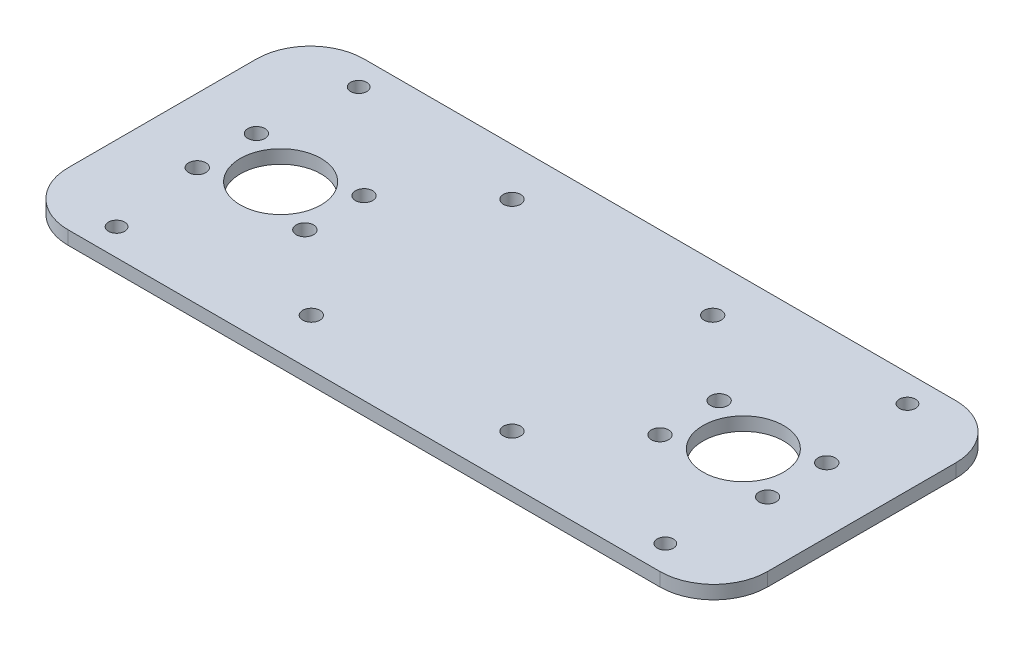
ISO-10303-21;
HEADER;
FILE_DESCRIPTION(('STEP AP214'),'2;1');
FILE_NAME('part.step','',(''),(''),'','','');
FILE_SCHEMA(('AUTOMOTIVE_DESIGN { 1 0 10303 214 1 1 1 1 }'));
ENDSEC;
DATA;
#1=APPLICATION_CONTEXT('core data for automotive mechanical design processes');
#2=APPLICATION_PROTOCOL_DEFINITION('international standard','automotive_design',2000,#1);
#3=PRODUCT_CONTEXT('',#1,'mechanical');
#4=PRODUCT('Part','Part','',(#3));
#5=PRODUCT_RELATED_PRODUCT_CATEGORY('part','',(#4));
#6=PRODUCT_DEFINITION_FORMATION('','',#4);
#7=PRODUCT_DEFINITION_CONTEXT('part definition',#1,'design');
#8=PRODUCT_DEFINITION('design','',#6,#7);
#9=PRODUCT_DEFINITION_SHAPE('','',#8);
#10=(LENGTH_UNIT() NAMED_UNIT(*) SI_UNIT(.MILLI.,.METRE.));
#11=(NAMED_UNIT(*) PLANE_ANGLE_UNIT() SI_UNIT($,.RADIAN.));
#12=(NAMED_UNIT(*) SI_UNIT($,.STERADIAN.) SOLID_ANGLE_UNIT());
#13=UNCERTAINTY_MEASURE_WITH_UNIT(LENGTH_MEASURE(1.E-05),#10,'distance_accuracy_value','');
#14=(GEOMETRIC_REPRESENTATION_CONTEXT(3) GLOBAL_UNCERTAINTY_ASSIGNED_CONTEXT((#13)) GLOBAL_UNIT_ASSIGNED_CONTEXT((#10,
#11,#12)) REPRESENTATION_CONTEXT('',''));
#15=CARTESIAN_POINT('',(0.,0.,0.));
#16=DIRECTION('',(0.,0.,1.));
#17=DIRECTION('',(1.,0.,0.));
#18=AXIS2_PLACEMENT_3D('',#15,#16,#17);
#19=CARTESIAN_POINT('',(10.,2.5,-45.));
#20=DIRECTION('',(0.,-1.,0.));
#21=DIRECTION('',(0.,0.,-1.));
#22=AXIS2_PLACEMENT_3D('',#19,#20,#21);
#23=CYLINDRICAL_SURFACE('',#22,10.);
#24=CARTESIAN_POINT('',(10.,0.,-45.));
#25=DIRECTION('',(0.,1.,0.));
#26=DIRECTION('',(0.,0.,1.));
#27=AXIS2_PLACEMENT_3D('',#24,#25,#26);
#28=CIRCLE('',#27,10.);
#29=CARTESIAN_POINT('',(10.0000000000001,0.,-55.));
#30=VERTEX_POINT('',#29);
#31=CARTESIAN_POINT('',(0.,0.,-44.9999999999999));
#32=VERTEX_POINT('',#31);
#33=EDGE_CURVE('E140',#30,#32,#28,.T.);
#34=ORIENTED_EDGE('',*,*,#33,.T.);
#35=DIRECTION('',(0.,-1.,0.));
#36=VECTOR('',#35,1.);
#37=CARTESIAN_POINT('',(0.,2.5,-44.9999999999999));
#38=LINE('',#37,#36);
#39=CARTESIAN_POINT('',(0.,2.5,-44.9999999999999));
#40=VERTEX_POINT('',#39);
#41=EDGE_CURVE('E11',#40,#32,#38,.T.);
#42=ORIENTED_EDGE('',*,*,#41,.F.);
#43=CARTESIAN_POINT('',(10.,2.5,-45.));
#44=DIRECTION('',(0.,1.,0.));
#45=DIRECTION('',(0.,0.,1.));
#46=AXIS2_PLACEMENT_3D('',#43,#44,#45);
#47=CIRCLE('',#46,10.);
#48=CARTESIAN_POINT('',(10.0000000000001,2.5,-55.));
#49=VERTEX_POINT('',#48);
#50=EDGE_CURVE('E155',#49,#40,#47,.T.);
#51=ORIENTED_EDGE('',*,*,#50,.F.);
#52=DIRECTION('',(0.,-1.,0.));
#53=VECTOR('',#52,1.);
#54=CARTESIAN_POINT('',(10.0000000000001,2.5,-55.));
#55=LINE('',#54,#53);
#56=EDGE_CURVE('E136',#49,#30,#55,.T.);
#57=ORIENTED_EDGE('',*,*,#56,.T.);
#58=EDGE_LOOP('',(#34,#42,#51,#57));
#59=FACE_BOUND('',#58,.T.);
#60=ADVANCED_FACE('F42',(#59),#23,.T.);
#61=CARTESIAN_POINT('',(0.,2.5,-10.0000000000001));
#62=DIRECTION('',(1.,0.,0.));
#63=DIRECTION('',(0.,0.,-1.));
#64=AXIS2_PLACEMENT_3D('',#61,#62,#63);
#65=PLANE('',#64);
#66=DIRECTION('',(0.,0.,1.));
#67=VECTOR('',#66,1.);
#68=CARTESIAN_POINT('',(0.,0.,-10.0000000000001));
#69=LINE('',#68,#67);
#70=CARTESIAN_POINT('',(0.,0.,-10.0000000000001));
#71=VERTEX_POINT('',#70);
#72=EDGE_CURVE('E143',#32,#71,#69,.T.);
#73=ORIENTED_EDGE('',*,*,#72,.T.);
#74=DIRECTION('',(0.,-1.,0.));
#75=VECTOR('',#74,1.);
#76=CARTESIAN_POINT('',(0.,2.5,-10.0000000000001));
#77=LINE('',#76,#75);
#78=CARTESIAN_POINT('',(0.,2.5,-10.0000000000001));
#79=VERTEX_POINT('',#78);
#80=EDGE_CURVE('E51',#79,#71,#77,.T.);
#81=ORIENTED_EDGE('',*,*,#80,.F.);
#82=DIRECTION('',(0.,0.,1.));
#83=VECTOR('',#82,1.);
#84=CARTESIAN_POINT('',(0.,2.5,-10.0000000000001));
#85=LINE('',#84,#83);
#86=EDGE_CURVE('E103',#40,#79,#85,.T.);
#87=ORIENTED_EDGE('',*,*,#86,.F.);
#88=ORIENTED_EDGE('',*,*,#41,.T.);
#89=EDGE_LOOP('',(#73,#81,#87,#88));
#90=FACE_BOUND('',#89,.T.);
#91=ADVANCED_FACE('F291',(#90),#65,.F.);
#92=CARTESIAN_POINT('',(10.,2.5,-10.));
#93=DIRECTION('',(0.,-1.,0.));
#94=DIRECTION('',(0.,0.,-1.));
#95=AXIS2_PLACEMENT_3D('',#92,#93,#94);
#96=CYLINDRICAL_SURFACE('',#95,10.);
#97=CARTESIAN_POINT('',(10.,0.,-10.));
#98=DIRECTION('',(0.,1.,0.));
#99=DIRECTION('',(0.,0.,1.));
#100=AXIS2_PLACEMENT_3D('',#97,#98,#99);
#101=CIRCLE('',#100,10.);
#102=CARTESIAN_POINT('',(10.0000000000001,0.,0.));
#103=VERTEX_POINT('',#102);
#104=EDGE_CURVE('E146',#71,#103,#101,.T.);
#105=ORIENTED_EDGE('',*,*,#104,.T.);
#106=DIRECTION('',(0.,-1.,0.));
#107=VECTOR('',#106,1.);
#108=CARTESIAN_POINT('',(10.0000000000001,2.5,0.));
#109=LINE('',#108,#107);
#110=CARTESIAN_POINT('',(10.0000000000001,2.5,0.));
#111=VERTEX_POINT('',#110);
#112=EDGE_CURVE('E162',#111,#103,#109,.T.);
#113=ORIENTED_EDGE('',*,*,#112,.F.);
#114=CARTESIAN_POINT('',(10.,2.5,-10.));
#115=DIRECTION('',(0.,1.,0.));
#116=DIRECTION('',(0.,0.,1.));
#117=AXIS2_PLACEMENT_3D('',#114,#115,#116);
#118=CIRCLE('',#117,10.);
#119=EDGE_CURVE('E258',#79,#111,#118,.T.);
#120=ORIENTED_EDGE('',*,*,#119,.F.);
#121=ORIENTED_EDGE('',*,*,#80,.T.);
#122=EDGE_LOOP('',(#105,#113,#120,#121));
#123=FACE_BOUND('',#122,.T.);
#124=ADVANCED_FACE('F295',(#123),#96,.T.);
#125=CARTESIAN_POINT('',(10.0000000000001,2.5,0.));
#126=DIRECTION('',(0.,0.,-1.));
#127=DIRECTION('',(-1.,0.,0.));
#128=AXIS2_PLACEMENT_3D('',#125,#126,#127);
#129=PLANE('',#128);
#130=DIRECTION('',(1.,0.,0.));
#131=VECTOR('',#130,1.);
#132=CARTESIAN_POINT('',(10.0000000000001,0.,0.));
#133=LINE('',#132,#131);
#134=CARTESIAN_POINT('',(120.,0.,0.));
#135=VERTEX_POINT('',#134);
#136=EDGE_CURVE('E148',#103,#135,#133,.T.);
#137=ORIENTED_EDGE('',*,*,#136,.T.);
#138=DIRECTION('',(0.,-1.,0.));
#139=VECTOR('',#138,1.);
#140=CARTESIAN_POINT('',(120.,2.5,0.));
#141=LINE('',#140,#139);
#142=CARTESIAN_POINT('',(120.,2.5,0.));
#143=VERTEX_POINT('',#142);
#144=EDGE_CURVE('E159',#143,#135,#141,.T.);
#145=ORIENTED_EDGE('',*,*,#144,.F.);
#146=DIRECTION('',(1.,0.,0.));
#147=VECTOR('',#146,1.);
#148=CARTESIAN_POINT('',(10.0000000000001,2.5,0.));
#149=LINE('',#148,#147);
#150=EDGE_CURVE('E260',#111,#143,#149,.T.);
#151=ORIENTED_EDGE('',*,*,#150,.F.);
#152=ORIENTED_EDGE('',*,*,#112,.T.);
#153=EDGE_LOOP('',(#137,#145,#151,#152));
#154=FACE_BOUND('',#153,.T.);
#155=ADVANCED_FACE('F266',(#154),#129,.F.);
#156=CARTESIAN_POINT('',(120.,2.5,-10.));
#157=DIRECTION('',(0.,-1.,0.));
#158=DIRECTION('',(0.,0.,-1.));
#159=AXIS2_PLACEMENT_3D('',#156,#157,#158);
#160=CYLINDRICAL_SURFACE('',#159,10.);
#161=CARTESIAN_POINT('',(120.,0.,-10.));
#162=DIRECTION('',(0.,1.,0.));
#163=DIRECTION('',(0.,0.,-1.));
#164=AXIS2_PLACEMENT_3D('',#161,#162,#163);
#165=CIRCLE('',#164,10.);
#166=CARTESIAN_POINT('',(130.,0.,-10.0000000000001));
#167=VERTEX_POINT('',#166);
#168=EDGE_CURVE('E150',#135,#167,#165,.T.);
#169=ORIENTED_EDGE('',*,*,#168,.T.);
#170=DIRECTION('',(0.,-1.,0.));
#171=VECTOR('',#170,1.);
#172=CARTESIAN_POINT('',(130.,2.5,-10.0000000000001));
#173=LINE('',#172,#171);
#174=CARTESIAN_POINT('',(130.,2.5,-10.0000000000001));
#175=VERTEX_POINT('',#174);
#176=EDGE_CURVE('E131',#175,#167,#173,.T.);
#177=ORIENTED_EDGE('',*,*,#176,.F.);
#178=CARTESIAN_POINT('',(120.,2.5,-10.));
#179=DIRECTION('',(0.,1.,0.));
#180=DIRECTION('',(0.,0.,-1.));
#181=AXIS2_PLACEMENT_3D('',#178,#179,#180);
#182=CIRCLE('',#181,10.);
#183=EDGE_CURVE('E122',#143,#175,#182,.T.);
#184=ORIENTED_EDGE('',*,*,#183,.F.);
#185=ORIENTED_EDGE('',*,*,#144,.T.);
#186=EDGE_LOOP('',(#169,#177,#184,#185));
#187=FACE_BOUND('',#186,.T.);
#188=ADVANCED_FACE('F270',(#187),#160,.T.);
#189=CARTESIAN_POINT('',(130.,2.5,-10.0000000000001));
#190=DIRECTION('',(-1.,0.,0.));
#191=DIRECTION('',(0.,0.,1.));
#192=AXIS2_PLACEMENT_3D('',#189,#190,#191);
#193=PLANE('',#192);
#194=DIRECTION('',(0.,0.,-1.));
#195=VECTOR('',#194,1.);
#196=CARTESIAN_POINT('',(130.,0.,-10.0000000000001));
#197=LINE('',#196,#195);
#198=CARTESIAN_POINT('',(130.,0.,-44.9999999999999));
#199=VERTEX_POINT('',#198);
#200=EDGE_CURVE('E130',#167,#199,#197,.T.);
#201=ORIENTED_EDGE('',*,*,#200,.T.);
#202=DIRECTION('',(0.,-1.,0.));
#203=VECTOR('',#202,1.);
#204=CARTESIAN_POINT('',(130.,2.5,-44.9999999999999));
#205=LINE('',#204,#203);
#206=CARTESIAN_POINT('',(130.,2.5,-44.9999999999999));
#207=VERTEX_POINT('',#206);
#208=EDGE_CURVE('E127',#207,#199,#205,.T.);
#209=ORIENTED_EDGE('',*,*,#208,.F.);
#210=DIRECTION('',(0.,0.,-1.));
#211=VECTOR('',#210,1.);
#212=CARTESIAN_POINT('',(130.,2.5,-10.0000000000001));
#213=LINE('',#212,#211);
#214=EDGE_CURVE('E116',#175,#207,#213,.T.);
#215=ORIENTED_EDGE('',*,*,#214,.F.);
#216=ORIENTED_EDGE('',*,*,#176,.T.);
#217=EDGE_LOOP('',(#201,#209,#215,#216));
#218=FACE_BOUND('',#217,.T.);
#219=ADVANCED_FACE('F128',(#218),#193,.F.);
#220=CARTESIAN_POINT('',(120.,2.5,-45.));
#221=DIRECTION('',(0.,-1.,0.));
#222=DIRECTION('',(0.,0.,-1.));
#223=AXIS2_PLACEMENT_3D('',#220,#221,#222);
#224=CYLINDRICAL_SURFACE('',#223,10.);
#225=CARTESIAN_POINT('',(120.,0.,-45.));
#226=DIRECTION('',(0.,1.,0.));
#227=DIRECTION('',(0.,0.,-1.));
#228=AXIS2_PLACEMENT_3D('',#225,#226,#227);
#229=CIRCLE('',#228,10.);
#230=CARTESIAN_POINT('',(120.,0.,-55.));
#231=VERTEX_POINT('',#230);
#232=EDGE_CURVE('E89',#199,#231,#229,.T.);
#233=ORIENTED_EDGE('',*,*,#232,.T.);
#234=DIRECTION('',(0.,-1.,0.));
#235=VECTOR('',#234,1.);
#236=CARTESIAN_POINT('',(120.,2.5,-55.));
#237=LINE('',#236,#235);
#238=CARTESIAN_POINT('',(120.,2.5,-55.));
#239=VERTEX_POINT('',#238);
#240=EDGE_CURVE('E132',#239,#231,#237,.T.);
#241=ORIENTED_EDGE('',*,*,#240,.F.);
#242=CARTESIAN_POINT('',(120.,2.5,-45.));
#243=DIRECTION('',(0.,1.,0.));
#244=DIRECTION('',(0.,0.,-1.));
#245=AXIS2_PLACEMENT_3D('',#242,#243,#244);
#246=CIRCLE('',#245,10.);
#247=EDGE_CURVE('E120',#207,#239,#246,.T.);
#248=ORIENTED_EDGE('',*,*,#247,.F.);
#249=ORIENTED_EDGE('',*,*,#208,.T.);
#250=EDGE_LOOP('',(#233,#241,#248,#249));
#251=FACE_BOUND('',#250,.T.);
#252=ADVANCED_FACE('F134',(#251),#224,.T.);
#253=CARTESIAN_POINT('',(10.0000000000001,2.5,-55.));
#254=DIRECTION('',(0.,0.,1.));
#255=DIRECTION('',(1.,0.,0.));
#256=AXIS2_PLACEMENT_3D('',#253,#254,#255);
#257=PLANE('',#256);
#258=DIRECTION('',(-1.,0.,0.));
#259=VECTOR('',#258,1.);
#260=CARTESIAN_POINT('',(10.0000000000001,0.,-55.));
#261=LINE('',#260,#259);
#262=EDGE_CURVE('E95',#231,#30,#261,.T.);
#263=ORIENTED_EDGE('',*,*,#262,.T.);
#264=ORIENTED_EDGE('',*,*,#56,.F.);
#265=DIRECTION('',(-1.,0.,0.));
#266=VECTOR('',#265,1.);
#267=CARTESIAN_POINT('',(10.0000000000001,2.5,-55.));
#268=LINE('',#267,#266);
#269=EDGE_CURVE('E60',#239,#49,#268,.T.);
#270=ORIENTED_EDGE('',*,*,#269,.F.);
#271=ORIENTED_EDGE('',*,*,#240,.T.);
#272=EDGE_LOOP('',(#263,#264,#270,#271));
#273=FACE_BOUND('',#272,.T.);
#274=ADVANCED_FACE('F278',(#273),#257,.F.);
#275=CARTESIAN_POINT('',(10.,2.5,-45.));
#276=DIRECTION('',(0.,1.,0.));
#277=DIRECTION('',(0.,0.,1.));
#278=AXIS2_PLACEMENT_3D('',#275,#276,#277);
#279=PLANE('',#278);
#280=CARTESIAN_POINT('',(22.,2.5,-27.5));
#281=DIRECTION('',(0.,1.,0.));
#282=DIRECTION('',(0.,0.,1.));
#283=AXIS2_PLACEMENT_3D('',#280,#281,#282);
#284=CIRCLE('',#283,7.5);
#285=CARTESIAN_POINT('',(22.,2.5,-20.));
#286=VERTEX_POINT('',#285);
#287=EDGE_CURVE('E514',#286,#286,#284,.T.);
#288=ORIENTED_EDGE('',*,*,#287,.F.);
#289=EDGE_LOOP('',(#288));
#290=FACE_BOUND('',#289,.T.);
#291=CARTESIAN_POINT('',(108.,2.5,-27.5));
#292=DIRECTION('',(0.,1.,0.));
#293=DIRECTION('',(0.,0.,1.));
#294=AXIS2_PLACEMENT_3D('',#291,#292,#293);
#295=CIRCLE('',#294,7.50000000000001);
#296=CARTESIAN_POINT('',(108.,2.5,-20.));
#297=VERTEX_POINT('',#296);
#298=EDGE_CURVE('E518',#297,#297,#295,.T.);
#299=ORIENTED_EDGE('',*,*,#298,.F.);
#300=EDGE_LOOP('',(#299));
#301=FACE_BOUND('',#300,.T.);
#302=CARTESIAN_POINT('',(46.35,2.5,-8.85000000000002));
#303=DIRECTION('',(0.,1.,0.));
#304=DIRECTION('',(0.,0.,-1.));
#305=AXIS2_PLACEMENT_3D('',#302,#303,#304);
#306=CIRCLE('',#305,1.6);
#307=CARTESIAN_POINT('',(46.35,2.5,-10.45));
#308=VERTEX_POINT('',#307);
#309=EDGE_CURVE('E527',#308,#308,#306,.T.);
#310=ORIENTED_EDGE('',*,*,#309,.F.);
#311=EDGE_LOOP('',(#310));
#312=FACE_BOUND('',#311,.T.);
#313=CARTESIAN_POINT('',(83.6499999999999,2.5,-8.84999999999998));
#314=DIRECTION('',(0.,1.,0.));
#315=DIRECTION('',(0.,0.,1.));
#316=AXIS2_PLACEMENT_3D('',#313,#314,#315);
#317=CIRCLE('',#316,1.59999999999999);
#318=CARTESIAN_POINT('',(83.6499999999999,2.5,-7.24999999999999));
#319=VERTEX_POINT('',#318);
#320=EDGE_CURVE('E531',#319,#319,#317,.T.);
#321=ORIENTED_EDGE('',*,*,#320,.F.);
#322=EDGE_LOOP('',(#321));
#323=FACE_BOUND('',#322,.T.);
#324=CARTESIAN_POINT('',(83.65,2.5,-46.15));
#325=DIRECTION('',(0.,1.,0.));
#326=DIRECTION('',(0.,0.,-1.));
#327=AXIS2_PLACEMENT_3D('',#324,#325,#326);
#328=CIRCLE('',#327,1.59999999999999);
#329=CARTESIAN_POINT('',(83.65,2.5,-47.75));
#330=VERTEX_POINT('',#329);
#331=EDGE_CURVE('E528',#330,#330,#328,.T.);
#332=ORIENTED_EDGE('',*,*,#331,.F.);
#333=EDGE_LOOP('',(#332));
#334=FACE_BOUND('',#333,.T.);
#335=CARTESIAN_POINT('',(46.35,2.5,-46.15));
#336=DIRECTION('',(0.,1.,0.));
#337=DIRECTION('',(0.,0.,1.));
#338=AXIS2_PLACEMENT_3D('',#335,#336,#337);
#339=CIRCLE('',#338,1.6);
#340=CARTESIAN_POINT('',(46.35,2.5,-44.55));
#341=VERTEX_POINT('',#340);
#342=EDGE_CURVE('E201',#341,#341,#339,.T.);
#343=ORIENTED_EDGE('',*,*,#342,.F.);
#344=EDGE_LOOP('',(#343));
#345=FACE_BOUND('',#344,.T.);
#346=CARTESIAN_POINT('',(98.,2.5,-22.));
#347=DIRECTION('',(0.,1.,0.));
#348=DIRECTION('',(0.,0.,1.));
#349=AXIS2_PLACEMENT_3D('',#346,#347,#348);
#350=CIRCLE('',#349,1.6);
#351=CARTESIAN_POINT('',(98.,2.5,-20.4));
#352=VERTEX_POINT('',#351);
#353=EDGE_CURVE('E217',#352,#352,#350,.T.);
#354=ORIENTED_EDGE('',*,*,#353,.F.);
#355=EDGE_LOOP('',(#354));
#356=FACE_BOUND('',#355,.T.);
#357=CARTESIAN_POINT('',(118.,2.5,-33.));
#358=DIRECTION('',(0.,1.,0.));
#359=DIRECTION('',(0.,0.,1.));
#360=AXIS2_PLACEMENT_3D('',#357,#358,#359);
#361=CIRCLE('',#360,1.60000000000001);
#362=CARTESIAN_POINT('',(118.,2.5,-31.4));
#363=VERTEX_POINT('',#362);
#364=EDGE_CURVE('E212',#363,#363,#361,.T.);
#365=ORIENTED_EDGE('',*,*,#364,.F.);
#366=EDGE_LOOP('',(#365));
#367=FACE_BOUND('',#366,.T.);
#368=CARTESIAN_POINT('',(118.,2.5,-22.));
#369=DIRECTION('',(0.,1.,0.));
#370=DIRECTION('',(0.,0.,1.));
#371=AXIS2_PLACEMENT_3D('',#368,#369,#370);
#372=CIRCLE('',#371,1.6);
#373=CARTESIAN_POINT('',(118.,2.5,-20.4));
#374=VERTEX_POINT('',#373);
#375=EDGE_CURVE('E208',#374,#374,#372,.T.);
#376=ORIENTED_EDGE('',*,*,#375,.F.);
#377=EDGE_LOOP('',(#376));
#378=FACE_BOUND('',#377,.T.);
#379=CARTESIAN_POINT('',(98.,2.5,-33.));
#380=DIRECTION('',(0.,1.,0.));
#381=DIRECTION('',(0.,0.,1.));
#382=AXIS2_PLACEMENT_3D('',#379,#380,#381);
#383=CIRCLE('',#382,1.60000000000001);
#384=CARTESIAN_POINT('',(98.,2.5,-31.4));
#385=VERTEX_POINT('',#384);
#386=EDGE_CURVE('E187',#385,#385,#383,.T.);
#387=ORIENTED_EDGE('',*,*,#386,.F.);
#388=EDGE_LOOP('',(#387));
#389=FACE_BOUND('',#388,.T.);
#390=CARTESIAN_POINT('',(32.,2.5,-33.));
#391=DIRECTION('',(0.,1.,0.));
#392=DIRECTION('',(0.,0.,1.));
#393=AXIS2_PLACEMENT_3D('',#390,#391,#392);
#394=CIRCLE('',#393,1.6);
#395=CARTESIAN_POINT('',(32.,2.5,-31.4));
#396=VERTEX_POINT('',#395);
#397=EDGE_CURVE('E180',#396,#396,#394,.T.);
#398=ORIENTED_EDGE('',*,*,#397,.F.);
#399=EDGE_LOOP('',(#398));
#400=FACE_BOUND('',#399,.T.);
#401=CARTESIAN_POINT('',(32.,2.5,-22.));
#402=DIRECTION('',(0.,1.,0.));
#403=DIRECTION('',(0.,0.,1.));
#404=AXIS2_PLACEMENT_3D('',#401,#402,#403);
#405=CIRCLE('',#404,1.6);
#406=CARTESIAN_POINT('',(32.,2.5,-20.4));
#407=VERTEX_POINT('',#406);
#408=EDGE_CURVE('E196',#407,#407,#405,.T.);
#409=ORIENTED_EDGE('',*,*,#408,.F.);
#410=EDGE_LOOP('',(#409));
#411=FACE_BOUND('',#410,.T.);
#412=CARTESIAN_POINT('',(12.,2.5,-22.));
#413=DIRECTION('',(0.,1.,0.));
#414=DIRECTION('',(0.,0.,1.));
#415=AXIS2_PLACEMENT_3D('',#412,#413,#414);
#416=CIRCLE('',#415,1.6);
#417=CARTESIAN_POINT('',(12.,2.5,-20.4));
#418=VERTEX_POINT('',#417);
#419=EDGE_CURVE('E175',#418,#418,#416,.T.);
#420=ORIENTED_EDGE('',*,*,#419,.F.);
#421=EDGE_LOOP('',(#420));
#422=FACE_BOUND('',#421,.T.);
#423=CARTESIAN_POINT('',(12.,2.5,-33.));
#424=DIRECTION('',(0.,1.,0.));
#425=DIRECTION('',(0.,0.,1.));
#426=AXIS2_PLACEMENT_3D('',#423,#424,#425);
#427=CIRCLE('',#426,1.6);
#428=CARTESIAN_POINT('',(12.,2.5,-31.4));
#429=VERTEX_POINT('',#428);
#430=EDGE_CURVE('E171',#429,#429,#427,.T.);
#431=ORIENTED_EDGE('',*,*,#430,.F.);
#432=EDGE_LOOP('',(#431));
#433=FACE_BOUND('',#432,.T.);
#434=CARTESIAN_POINT('',(116.,2.5,-50.));
#435=DIRECTION('',(0.,1.,0.));
#436=DIRECTION('',(0.,0.,-1.));
#437=AXIS2_PLACEMENT_3D('',#434,#435,#436);
#438=CIRCLE('',#437,1.5);
#439=CARTESIAN_POINT('',(116.,2.5,-51.5));
#440=VERTEX_POINT('',#439);
#441=EDGE_CURVE('E170',#440,#440,#438,.T.);
#442=ORIENTED_EDGE('',*,*,#441,.F.);
#443=EDGE_LOOP('',(#442));
#444=FACE_BOUND('',#443,.T.);
#445=CARTESIAN_POINT('',(116.,2.5,-4.99999999999997));
#446=DIRECTION('',(0.,1.,0.));
#447=DIRECTION('',(0.,0.,-1.));
#448=AXIS2_PLACEMENT_3D('',#445,#446,#447);
#449=CIRCLE('',#448,1.5);
#450=CARTESIAN_POINT('',(116.,2.5,-6.49999999999997));
#451=VERTEX_POINT('',#450);
#452=EDGE_CURVE('E237',#451,#451,#449,.T.);
#453=ORIENTED_EDGE('',*,*,#452,.F.);
#454=EDGE_LOOP('',(#453));
#455=FACE_BOUND('',#454,.T.);
#456=CARTESIAN_POINT('',(14.,2.5,-50.));
#457=DIRECTION('',(0.,1.,0.));
#458=DIRECTION('',(0.,0.,1.));
#459=AXIS2_PLACEMENT_3D('',#456,#457,#458);
#460=CIRCLE('',#459,1.5);
#461=CARTESIAN_POINT('',(14.,2.5,-48.5));
#462=VERTEX_POINT('',#461);
#463=EDGE_CURVE('E243',#462,#462,#460,.T.);
#464=ORIENTED_EDGE('',*,*,#463,.F.);
#465=EDGE_LOOP('',(#464));
#466=FACE_BOUND('',#465,.T.);
#467=CARTESIAN_POINT('',(14.,2.5,-5.));
#468=DIRECTION('',(0.,1.,0.));
#469=DIRECTION('',(0.,0.,1.));
#470=AXIS2_PLACEMENT_3D('',#467,#468,#469);
#471=CIRCLE('',#470,1.5);
#472=CARTESIAN_POINT('',(14.,2.5,-3.5));
#473=VERTEX_POINT('',#472);
#474=EDGE_CURVE('E249',#473,#473,#471,.T.);
#475=ORIENTED_EDGE('',*,*,#474,.F.);
#476=EDGE_LOOP('',(#475));
#477=FACE_BOUND('',#476,.T.);
#478=ORIENTED_EDGE('',*,*,#50,.T.);
#479=ORIENTED_EDGE('',*,*,#86,.T.);
#480=ORIENTED_EDGE('',*,*,#119,.T.);
#481=ORIENTED_EDGE('',*,*,#150,.T.);
#482=ORIENTED_EDGE('',*,*,#183,.T.);
#483=ORIENTED_EDGE('',*,*,#214,.T.);
#484=ORIENTED_EDGE('',*,*,#247,.T.);
#485=ORIENTED_EDGE('',*,*,#269,.T.);
#486=EDGE_LOOP('',(#478,#479,#480,#481,#482,#483,#484,#485));
#487=FACE_BOUND('',#486,.T.);
#488=ADVANCED_FACE('F118',(#290,#301,#312,#323,#334,#345,#356,#367,#378,#389,#400,#411,#422,
#433,#444,#455,#466,#477,#487),#279,.T.);
#489=CARTESIAN_POINT('',(10.,0.,-45.));
#490=DIRECTION('',(0.,1.,0.));
#491=DIRECTION('',(0.,0.,1.));
#492=AXIS2_PLACEMENT_3D('',#489,#490,#491);
#493=PLANE('',#492);
#494=CARTESIAN_POINT('',(22.,0.,-27.5));
#495=DIRECTION('',(0.,-1.,0.));
#496=DIRECTION('',(0.,0.,-1.));
#497=AXIS2_PLACEMENT_3D('',#494,#495,#496);
#498=CIRCLE('',#497,7.5);
#499=CARTESIAN_POINT('',(22.,0.,-35.));
#500=VERTEX_POINT('',#499);
#501=EDGE_CURVE('E517',#500,#500,#498,.T.);
#502=ORIENTED_EDGE('',*,*,#501,.F.);
#503=EDGE_LOOP('',(#502));
#504=FACE_BOUND('',#503,.T.);
#505=CARTESIAN_POINT('',(108.,0.,-27.5));
#506=DIRECTION('',(0.,-1.,0.));
#507=DIRECTION('',(0.,0.,1.));
#508=AXIS2_PLACEMENT_3D('',#505,#506,#507);
#509=CIRCLE('',#508,7.50000000000001);
#510=CARTESIAN_POINT('',(108.,0.,-20.));
#511=VERTEX_POINT('',#510);
#512=EDGE_CURVE('E519',#511,#511,#509,.T.);
#513=ORIENTED_EDGE('',*,*,#512,.F.);
#514=EDGE_LOOP('',(#513));
#515=FACE_BOUND('',#514,.T.);
#516=CARTESIAN_POINT('',(46.35,0.,-8.85000000000002));
#517=DIRECTION('',(0.,1.,0.));
#518=DIRECTION('',(0.,0.,1.));
#519=AXIS2_PLACEMENT_3D('',#516,#517,#518);
#520=CIRCLE('',#519,1.6);
#521=CARTESIAN_POINT('',(46.35,0.,-7.25000000000002));
#522=VERTEX_POINT('',#521);
#523=EDGE_CURVE('E45',#522,#522,#520,.T.);
#524=ORIENTED_EDGE('',*,*,#523,.T.);
#525=EDGE_LOOP('',(#524));
#526=FACE_BOUND('',#525,.T.);
#527=CARTESIAN_POINT('',(83.6499999999999,0.,-8.84999999999998));
#528=DIRECTION('',(0.,1.,0.));
#529=DIRECTION('',(0.,0.,1.));
#530=AXIS2_PLACEMENT_3D('',#527,#528,#529);
#531=CIRCLE('',#530,1.59999999999999);
#532=CARTESIAN_POINT('',(83.6499999999999,0.,-7.24999999999999));
#533=VERTEX_POINT('',#532);
#534=EDGE_CURVE('E203',#533,#533,#531,.T.);
#535=ORIENTED_EDGE('',*,*,#534,.T.);
#536=EDGE_LOOP('',(#535));
#537=FACE_BOUND('',#536,.T.);
#538=CARTESIAN_POINT('',(83.65,0.,-46.15));
#539=DIRECTION('',(0.,1.,0.));
#540=DIRECTION('',(0.,0.,1.));
#541=AXIS2_PLACEMENT_3D('',#538,#539,#540);
#542=CIRCLE('',#541,1.59999999999999);
#543=CARTESIAN_POINT('',(83.65,0.,-44.55));
#544=VERTEX_POINT('',#543);
#545=EDGE_CURVE('E200',#544,#544,#542,.T.);
#546=ORIENTED_EDGE('',*,*,#545,.T.);
#547=EDGE_LOOP('',(#546));
#548=FACE_BOUND('',#547,.T.);
#549=CARTESIAN_POINT('',(46.35,0.,-46.15));
#550=DIRECTION('',(0.,1.,0.));
#551=DIRECTION('',(0.,0.,1.));
#552=AXIS2_PLACEMENT_3D('',#549,#550,#551);
#553=CIRCLE('',#552,1.6);
#554=CARTESIAN_POINT('',(46.35,0.,-44.55));
#555=VERTEX_POINT('',#554);
#556=EDGE_CURVE('E197',#555,#555,#553,.T.);
#557=ORIENTED_EDGE('',*,*,#556,.T.);
#558=EDGE_LOOP('',(#557));
#559=FACE_BOUND('',#558,.T.);
#560=CARTESIAN_POINT('',(98.,0.,-22.));
#561=DIRECTION('',(0.,1.,0.));
#562=DIRECTION('',(0.,0.,1.));
#563=AXIS2_PLACEMENT_3D('',#560,#561,#562);
#564=CIRCLE('',#563,1.6);
#565=CARTESIAN_POINT('',(98.,0.,-20.4));
#566=VERTEX_POINT('',#565);
#567=EDGE_CURVE('E193',#566,#566,#564,.T.);
#568=ORIENTED_EDGE('',*,*,#567,.T.);
#569=EDGE_LOOP('',(#568));
#570=FACE_BOUND('',#569,.T.);
#571=CARTESIAN_POINT('',(118.,0.,-33.));
#572=DIRECTION('',(0.,1.,0.));
#573=DIRECTION('',(0.,0.,1.));
#574=AXIS2_PLACEMENT_3D('',#571,#572,#573);
#575=CIRCLE('',#574,1.60000000000001);
#576=CARTESIAN_POINT('',(118.,0.,-31.4));
#577=VERTEX_POINT('',#576);
#578=EDGE_CURVE('E190',#577,#577,#575,.T.);
#579=ORIENTED_EDGE('',*,*,#578,.T.);
#580=EDGE_LOOP('',(#579));
#581=FACE_BOUND('',#580,.T.);
#582=CARTESIAN_POINT('',(118.,0.,-22.));
#583=DIRECTION('',(0.,1.,0.));
#584=DIRECTION('',(0.,0.,1.));
#585=AXIS2_PLACEMENT_3D('',#582,#583,#584);
#586=CIRCLE('',#585,1.6);
#587=CARTESIAN_POINT('',(118.,0.,-20.4));
#588=VERTEX_POINT('',#587);
#589=EDGE_CURVE('E186',#588,#588,#586,.T.);
#590=ORIENTED_EDGE('',*,*,#589,.T.);
#591=EDGE_LOOP('',(#590));
#592=FACE_BOUND('',#591,.T.);
#593=CARTESIAN_POINT('',(98.,0.,-33.));
#594=DIRECTION('',(0.,1.,0.));
#595=DIRECTION('',(0.,0.,1.));
#596=AXIS2_PLACEMENT_3D('',#593,#594,#595);
#597=CIRCLE('',#596,1.60000000000001);
#598=CARTESIAN_POINT('',(98.,0.,-31.4));
#599=VERTEX_POINT('',#598);
#600=EDGE_CURVE('E183',#599,#599,#597,.T.);
#601=ORIENTED_EDGE('',*,*,#600,.T.);
#602=EDGE_LOOP('',(#601));
#603=FACE_BOUND('',#602,.T.);
#604=CARTESIAN_POINT('',(32.,0.,-33.));
#605=DIRECTION('',(0.,1.,0.));
#606=DIRECTION('',(0.,0.,1.));
#607=AXIS2_PLACEMENT_3D('',#604,#605,#606);
#608=CIRCLE('',#607,1.6);
#609=CARTESIAN_POINT('',(32.,0.,-31.4));
#610=VERTEX_POINT('',#609);
#611=EDGE_CURVE('E179',#610,#610,#608,.T.);
#612=ORIENTED_EDGE('',*,*,#611,.T.);
#613=EDGE_LOOP('',(#612));
#614=FACE_BOUND('',#613,.T.);
#615=CARTESIAN_POINT('',(32.,0.,-22.));
#616=DIRECTION('',(0.,1.,0.));
#617=DIRECTION('',(0.,0.,1.));
#618=AXIS2_PLACEMENT_3D('',#615,#616,#617);
#619=CIRCLE('',#618,1.6);
#620=CARTESIAN_POINT('',(32.,0.,-20.4));
#621=VERTEX_POINT('',#620);
#622=EDGE_CURVE('E176',#621,#621,#619,.T.);
#623=ORIENTED_EDGE('',*,*,#622,.T.);
#624=EDGE_LOOP('',(#623));
#625=FACE_BOUND('',#624,.T.);
#626=CARTESIAN_POINT('',(12.,0.,-22.));
#627=DIRECTION('',(0.,1.,0.));
#628=DIRECTION('',(0.,0.,1.));
#629=AXIS2_PLACEMENT_3D('',#626,#627,#628);
#630=CIRCLE('',#629,1.6);
#631=CARTESIAN_POINT('',(12.,0.,-20.4));
#632=VERTEX_POINT('',#631);
#633=EDGE_CURVE('E172',#632,#632,#630,.T.);
#634=ORIENTED_EDGE('',*,*,#633,.T.);
#635=EDGE_LOOP('',(#634));
#636=FACE_BOUND('',#635,.T.);
#637=CARTESIAN_POINT('',(12.,0.,-33.));
#638=DIRECTION('',(0.,1.,0.));
#639=DIRECTION('',(0.,0.,1.));
#640=AXIS2_PLACEMENT_3D('',#637,#638,#639);
#641=CIRCLE('',#640,1.6);
#642=CARTESIAN_POINT('',(12.,0.,-31.4));
#643=VERTEX_POINT('',#642);
#644=EDGE_CURVE('E167',#643,#643,#641,.T.);
#645=ORIENTED_EDGE('',*,*,#644,.T.);
#646=EDGE_LOOP('',(#645));
#647=FACE_BOUND('',#646,.T.);
#648=CARTESIAN_POINT('',(116.,0.,-50.));
#649=DIRECTION('',(0.,1.,0.));
#650=DIRECTION('',(0.,0.,-1.));
#651=AXIS2_PLACEMENT_3D('',#648,#649,#650);
#652=CIRCLE('',#651,1.5);
#653=CARTESIAN_POINT('',(116.,0.,-51.5));
#654=VERTEX_POINT('',#653);
#655=EDGE_CURVE('E234',#654,#654,#652,.T.);
#656=ORIENTED_EDGE('',*,*,#655,.T.);
#657=EDGE_LOOP('',(#656));
#658=FACE_BOUND('',#657,.T.);
#659=CARTESIAN_POINT('',(116.,0.,-4.99999999999997));
#660=DIRECTION('',(0.,1.,0.));
#661=DIRECTION('',(0.,0.,-1.));
#662=AXIS2_PLACEMENT_3D('',#659,#660,#661);
#663=CIRCLE('',#662,1.5);
#664=CARTESIAN_POINT('',(116.,0.,-6.49999999999997));
#665=VERTEX_POINT('',#664);
#666=EDGE_CURVE('E240',#665,#665,#663,.T.);
#667=ORIENTED_EDGE('',*,*,#666,.T.);
#668=EDGE_LOOP('',(#667));
#669=FACE_BOUND('',#668,.T.);
#670=CARTESIAN_POINT('',(14.,0.,-50.));
#671=DIRECTION('',(0.,1.,0.));
#672=DIRECTION('',(0.,0.,1.));
#673=AXIS2_PLACEMENT_3D('',#670,#671,#672);
#674=CIRCLE('',#673,1.5);
#675=CARTESIAN_POINT('',(14.,0.,-48.5));
#676=VERTEX_POINT('',#675);
#677=EDGE_CURVE('E246',#676,#676,#674,.T.);
#678=ORIENTED_EDGE('',*,*,#677,.T.);
#679=EDGE_LOOP('',(#678));
#680=FACE_BOUND('',#679,.T.);
#681=CARTESIAN_POINT('',(14.,0.,-5.));
#682=DIRECTION('',(0.,1.,0.));
#683=DIRECTION('',(0.,0.,1.));
#684=AXIS2_PLACEMENT_3D('',#681,#682,#683);
#685=CIRCLE('',#684,1.5);
#686=CARTESIAN_POINT('',(14.,0.,-3.5));
#687=VERTEX_POINT('',#686);
#688=EDGE_CURVE('E144',#687,#687,#685,.T.);
#689=ORIENTED_EDGE('',*,*,#688,.T.);
#690=EDGE_LOOP('',(#689));
#691=FACE_BOUND('',#690,.T.);
#692=ORIENTED_EDGE('',*,*,#33,.F.);
#693=ORIENTED_EDGE('',*,*,#262,.F.);
#694=ORIENTED_EDGE('',*,*,#232,.F.);
#695=ORIENTED_EDGE('',*,*,#200,.F.);
#696=ORIENTED_EDGE('',*,*,#168,.F.);
#697=ORIENTED_EDGE('',*,*,#136,.F.);
#698=ORIENTED_EDGE('',*,*,#104,.F.);
#699=ORIENTED_EDGE('',*,*,#72,.F.);
#700=EDGE_LOOP('',(#692,#693,#694,#695,#696,#697,#698,#699));
#701=FACE_BOUND('',#700,.T.);
#702=ADVANCED_FACE('F273',(#504,#515,#526,#537,#548,#559,#570,#581,#592,#603,#614,#625,#636,
#647,#658,#669,#680,#691,#701),#493,.F.);
#703=CARTESIAN_POINT('',(14.,0.,-5.));
#704=DIRECTION('',(0.,1.,0.));
#705=DIRECTION('',(0.,0.,1.));
#706=AXIS2_PLACEMENT_3D('',#703,#704,#705);
#707=CYLINDRICAL_SURFACE('',#706,1.5);
#708=ORIENTED_EDGE('',*,*,#688,.F.);
#709=EDGE_LOOP('',(#708));
#710=FACE_BOUND('',#709,.T.);
#711=ORIENTED_EDGE('',*,*,#474,.T.);
#712=EDGE_LOOP('',(#711));
#713=FACE_BOUND('',#712,.T.);
#714=ADVANCED_FACE('F325',(#710,#713),#707,.F.);
#715=CARTESIAN_POINT('',(14.,0.,-50.));
#716=DIRECTION('',(0.,1.,0.));
#717=DIRECTION('',(0.,0.,1.));
#718=AXIS2_PLACEMENT_3D('',#715,#716,#717);
#719=CYLINDRICAL_SURFACE('',#718,1.5);
#720=ORIENTED_EDGE('',*,*,#677,.F.);
#721=EDGE_LOOP('',(#720));
#722=FACE_BOUND('',#721,.T.);
#723=ORIENTED_EDGE('',*,*,#463,.T.);
#724=EDGE_LOOP('',(#723));
#725=FACE_BOUND('',#724,.T.);
#726=ADVANCED_FACE('F330',(#722,#725),#719,.F.);
#727=CARTESIAN_POINT('',(116.,0.,-4.99999999999997));
#728=DIRECTION('',(0.,1.,0.));
#729=DIRECTION('',(0.,0.,1.));
#730=AXIS2_PLACEMENT_3D('',#727,#728,#729);
#731=CYLINDRICAL_SURFACE('',#730,1.5);
#732=ORIENTED_EDGE('',*,*,#666,.F.);
#733=EDGE_LOOP('',(#732));
#734=FACE_BOUND('',#733,.T.);
#735=ORIENTED_EDGE('',*,*,#452,.T.);
#736=EDGE_LOOP('',(#735));
#737=FACE_BOUND('',#736,.T.);
#738=ADVANCED_FACE('F342',(#734,#737),#731,.F.);
#739=CARTESIAN_POINT('',(116.,0.,-50.));
#740=DIRECTION('',(0.,1.,0.));
#741=DIRECTION('',(0.,0.,1.));
#742=AXIS2_PLACEMENT_3D('',#739,#740,#741);
#743=CYLINDRICAL_SURFACE('',#742,1.5);
#744=ORIENTED_EDGE('',*,*,#655,.F.);
#745=EDGE_LOOP('',(#744));
#746=FACE_BOUND('',#745,.T.);
#747=ORIENTED_EDGE('',*,*,#441,.T.);
#748=EDGE_LOOP('',(#747));
#749=FACE_BOUND('',#748,.T.);
#750=ADVANCED_FACE('F352',(#746,#749),#743,.F.);
#751=CARTESIAN_POINT('',(12.,-7.5,-33.));
#752=DIRECTION('',(0.,1.,0.));
#753=DIRECTION('',(0.,0.,1.));
#754=AXIS2_PLACEMENT_3D('',#751,#752,#753);
#755=CYLINDRICAL_SURFACE('',#754,1.6);
#756=ORIENTED_EDGE('',*,*,#430,.T.);
#757=EDGE_LOOP('',(#756));
#758=FACE_BOUND('',#757,.T.);
#759=ORIENTED_EDGE('',*,*,#644,.F.);
#760=EDGE_LOOP('',(#759));
#761=FACE_BOUND('',#760,.T.);
#762=ADVANCED_FACE('F362',(#758,#761),#755,.F.);
#763=CARTESIAN_POINT('',(12.,-7.5,-22.));
#764=DIRECTION('',(0.,1.,0.));
#765=DIRECTION('',(0.,0.,1.));
#766=AXIS2_PLACEMENT_3D('',#763,#764,#765);
#767=CYLINDRICAL_SURFACE('',#766,1.6);
#768=ORIENTED_EDGE('',*,*,#419,.T.);
#769=EDGE_LOOP('',(#768));
#770=FACE_BOUND('',#769,.T.);
#771=ORIENTED_EDGE('',*,*,#633,.F.);
#772=EDGE_LOOP('',(#771));
#773=FACE_BOUND('',#772,.T.);
#774=ADVANCED_FACE('F371',(#770,#773),#767,.F.);
#775=CARTESIAN_POINT('',(32.,-7.5,-22.));
#776=DIRECTION('',(0.,1.,0.));
#777=DIRECTION('',(0.,0.,1.));
#778=AXIS2_PLACEMENT_3D('',#775,#776,#777);
#779=CYLINDRICAL_SURFACE('',#778,1.6);
#780=ORIENTED_EDGE('',*,*,#408,.T.);
#781=EDGE_LOOP('',(#780));
#782=FACE_BOUND('',#781,.T.);
#783=ORIENTED_EDGE('',*,*,#622,.F.);
#784=EDGE_LOOP('',(#783));
#785=FACE_BOUND('',#784,.T.);
#786=ADVANCED_FACE('F380',(#782,#785),#779,.F.);
#787=CARTESIAN_POINT('',(32.,-7.5,-33.));
#788=DIRECTION('',(0.,1.,0.));
#789=DIRECTION('',(0.,0.,1.));
#790=AXIS2_PLACEMENT_3D('',#787,#788,#789);
#791=CYLINDRICAL_SURFACE('',#790,1.6);
#792=ORIENTED_EDGE('',*,*,#397,.T.);
#793=EDGE_LOOP('',(#792));
#794=FACE_BOUND('',#793,.T.);
#795=ORIENTED_EDGE('',*,*,#611,.F.);
#796=EDGE_LOOP('',(#795));
#797=FACE_BOUND('',#796,.T.);
#798=ADVANCED_FACE('F389',(#794,#797),#791,.F.);
#799=CARTESIAN_POINT('',(98.,-7.5,-33.));
#800=DIRECTION('',(0.,1.,0.));
#801=DIRECTION('',(0.,0.,1.));
#802=AXIS2_PLACEMENT_3D('',#799,#800,#801);
#803=CYLINDRICAL_SURFACE('',#802,1.60000000000001);
#804=ORIENTED_EDGE('',*,*,#386,.T.);
#805=EDGE_LOOP('',(#804));
#806=FACE_BOUND('',#805,.T.);
#807=ORIENTED_EDGE('',*,*,#600,.F.);
#808=EDGE_LOOP('',(#807));
#809=FACE_BOUND('',#808,.T.);
#810=ADVANCED_FACE('F398',(#806,#809),#803,.F.);
#811=CARTESIAN_POINT('',(118.,-7.5,-22.));
#812=DIRECTION('',(0.,1.,0.));
#813=DIRECTION('',(0.,0.,1.));
#814=AXIS2_PLACEMENT_3D('',#811,#812,#813);
#815=CYLINDRICAL_SURFACE('',#814,1.6);
#816=ORIENTED_EDGE('',*,*,#375,.T.);
#817=EDGE_LOOP('',(#816));
#818=FACE_BOUND('',#817,.T.);
#819=ORIENTED_EDGE('',*,*,#589,.F.);
#820=EDGE_LOOP('',(#819));
#821=FACE_BOUND('',#820,.T.);
#822=ADVANCED_FACE('F407',(#818,#821),#815,.F.);
#823=CARTESIAN_POINT('',(118.,-7.5,-33.));
#824=DIRECTION('',(0.,1.,0.));
#825=DIRECTION('',(0.,0.,1.));
#826=AXIS2_PLACEMENT_3D('',#823,#824,#825);
#827=CYLINDRICAL_SURFACE('',#826,1.60000000000001);
#828=ORIENTED_EDGE('',*,*,#364,.T.);
#829=EDGE_LOOP('',(#828));
#830=FACE_BOUND('',#829,.T.);
#831=ORIENTED_EDGE('',*,*,#578,.F.);
#832=EDGE_LOOP('',(#831));
#833=FACE_BOUND('',#832,.T.);
#834=ADVANCED_FACE('F416',(#830,#833),#827,.F.);
#835=CARTESIAN_POINT('',(98.,-7.5,-22.));
#836=DIRECTION('',(0.,1.,0.));
#837=DIRECTION('',(0.,0.,1.));
#838=AXIS2_PLACEMENT_3D('',#835,#836,#837);
#839=CYLINDRICAL_SURFACE('',#838,1.6);
#840=ORIENTED_EDGE('',*,*,#353,.T.);
#841=EDGE_LOOP('',(#840));
#842=FACE_BOUND('',#841,.T.);
#843=ORIENTED_EDGE('',*,*,#567,.F.);
#844=EDGE_LOOP('',(#843));
#845=FACE_BOUND('',#844,.T.);
#846=ADVANCED_FACE('F424',(#842,#845),#839,.F.);
#847=CARTESIAN_POINT('',(46.35,-7.5,-46.15));
#848=DIRECTION('',(0.,1.,0.));
#849=DIRECTION('',(0.,0.,1.));
#850=AXIS2_PLACEMENT_3D('',#847,#848,#849);
#851=CYLINDRICAL_SURFACE('',#850,1.6);
#852=ORIENTED_EDGE('',*,*,#342,.T.);
#853=EDGE_LOOP('',(#852));
#854=FACE_BOUND('',#853,.T.);
#855=ORIENTED_EDGE('',*,*,#556,.F.);
#856=EDGE_LOOP('',(#855));
#857=FACE_BOUND('',#856,.T.);
#858=ADVANCED_FACE('F433',(#854,#857),#851,.F.);
#859=CARTESIAN_POINT('',(83.65,-7.5,-46.15));
#860=DIRECTION('',(0.,1.,0.));
#861=DIRECTION('',(0.,0.,1.));
#862=AXIS2_PLACEMENT_3D('',#859,#860,#861);
#863=CYLINDRICAL_SURFACE('',#862,1.59999999999999);
#864=ORIENTED_EDGE('',*,*,#331,.T.);
#865=EDGE_LOOP('',(#864));
#866=FACE_BOUND('',#865,.T.);
#867=ORIENTED_EDGE('',*,*,#545,.F.);
#868=EDGE_LOOP('',(#867));
#869=FACE_BOUND('',#868,.T.);
#870=ADVANCED_FACE('F442',(#866,#869),#863,.F.);
#871=CARTESIAN_POINT('',(83.6499999999999,-7.5,-8.84999999999998));
#872=DIRECTION('',(0.,1.,0.));
#873=DIRECTION('',(0.,0.,1.));
#874=AXIS2_PLACEMENT_3D('',#871,#872,#873);
#875=CYLINDRICAL_SURFACE('',#874,1.59999999999999);
#876=ORIENTED_EDGE('',*,*,#320,.T.);
#877=EDGE_LOOP('',(#876));
#878=FACE_BOUND('',#877,.T.);
#879=ORIENTED_EDGE('',*,*,#534,.F.);
#880=EDGE_LOOP('',(#879));
#881=FACE_BOUND('',#880,.T.);
#882=ADVANCED_FACE('F451',(#878,#881),#875,.F.);
#883=CARTESIAN_POINT('',(46.35,-7.5,-8.85000000000002));
#884=DIRECTION('',(0.,1.,0.));
#885=DIRECTION('',(0.,0.,1.));
#886=AXIS2_PLACEMENT_3D('',#883,#884,#885);
#887=CYLINDRICAL_SURFACE('',#886,1.6);
#888=ORIENTED_EDGE('',*,*,#309,.T.);
#889=EDGE_LOOP('',(#888));
#890=FACE_BOUND('',#889,.T.);
#891=ORIENTED_EDGE('',*,*,#523,.F.);
#892=EDGE_LOOP('',(#891));
#893=FACE_BOUND('',#892,.T.);
#894=ADVANCED_FACE('F460',(#890,#893),#887,.F.);
#895=CARTESIAN_POINT('',(108.,10.,-27.5));
#896=DIRECTION('',(0.,-1.,0.));
#897=DIRECTION('',(0.,0.,-1.));
#898=AXIS2_PLACEMENT_3D('',#895,#896,#897);
#899=CYLINDRICAL_SURFACE('',#898,7.50000000000001);
#900=ORIENTED_EDGE('',*,*,#298,.T.);
#901=EDGE_LOOP('',(#900));
#902=FACE_BOUND('',#901,.T.);
#903=ORIENTED_EDGE('',*,*,#512,.T.);
#904=EDGE_LOOP('',(#903));
#905=FACE_BOUND('',#904,.T.);
#906=ADVANCED_FACE('F468',(#902,#905),#899,.F.);
#907=CARTESIAN_POINT('',(22.,10.,-27.5));
#908=DIRECTION('',(0.,-1.,0.));
#909=DIRECTION('',(0.,0.,-1.));
#910=AXIS2_PLACEMENT_3D('',#907,#908,#909);
#911=CYLINDRICAL_SURFACE('',#910,7.5);
#912=ORIENTED_EDGE('',*,*,#287,.T.);
#913=EDGE_LOOP('',(#912));
#914=FACE_BOUND('',#913,.T.);
#915=ORIENTED_EDGE('',*,*,#501,.T.);
#916=EDGE_LOOP('',(#915));
#917=FACE_BOUND('',#916,.T.);
#918=ADVANCED_FACE('F484',(#914,#917),#911,.F.);
#919=CLOSED_SHELL('',(#60,#91,#124,#155,#188,#219,#252,#274,#488,#702,#714,#726,#738,#750,#762,
#774,#786,#798,#810,#822,#834,#846,#858,#870,#882,#894,#906,#918));
#920=MANIFOLD_SOLID_BREP('B2',#919);
#921=ADVANCED_BREP_SHAPE_REPRESENTATION('',(#18,#920),#14);
#922=SHAPE_DEFINITION_REPRESENTATION(#9,#921);
ENDSEC;
END-ISO-10303-21;
